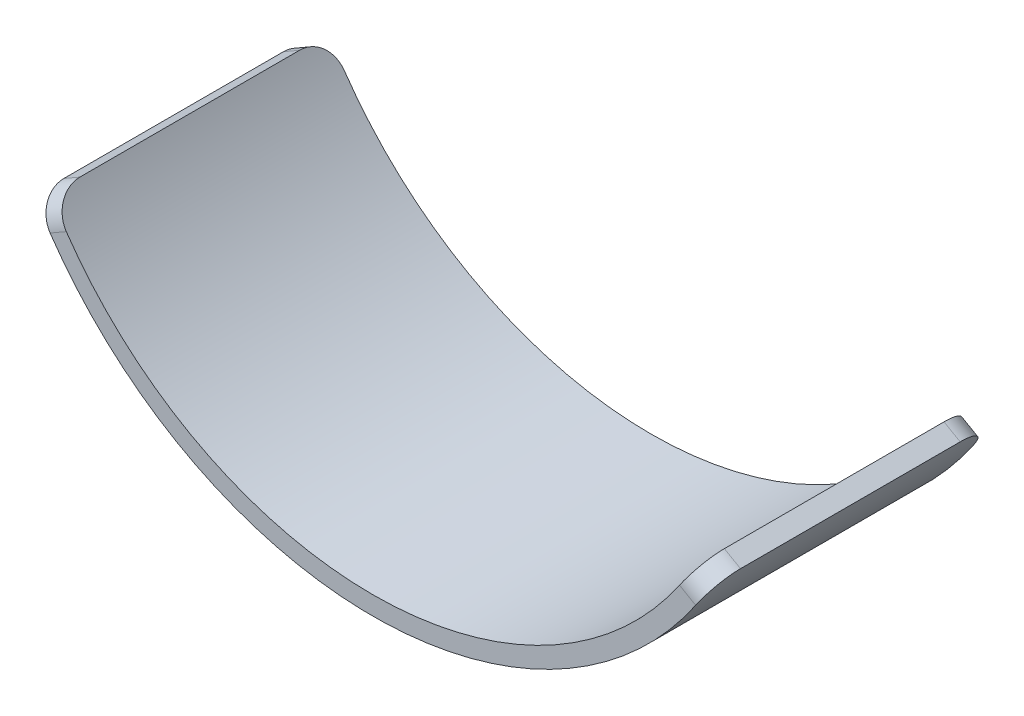
ISO-10303-21;
HEADER;
FILE_DESCRIPTION(('STEP AP214'),'2;1');
FILE_NAME('part.step','',(''),(''),'','','');
FILE_SCHEMA(('AUTOMOTIVE_DESIGN { 1 0 10303 214 1 1 1 1 }'));
ENDSEC;
DATA;
#1=APPLICATION_CONTEXT('core data for automotive mechanical design processes');
#2=APPLICATION_PROTOCOL_DEFINITION('international standard','automotive_design',2000,#1);
#3=PRODUCT_CONTEXT('',#1,'mechanical');
#4=PRODUCT('Part','Part','',(#3));
#5=PRODUCT_RELATED_PRODUCT_CATEGORY('part','',(#4));
#6=PRODUCT_DEFINITION_FORMATION('','',#4);
#7=PRODUCT_DEFINITION_CONTEXT('part definition',#1,'design');
#8=PRODUCT_DEFINITION('design','',#6,#7);
#9=PRODUCT_DEFINITION_SHAPE('','',#8);
#10=(LENGTH_UNIT() NAMED_UNIT(*) SI_UNIT(.MILLI.,.METRE.));
#11=(NAMED_UNIT(*) PLANE_ANGLE_UNIT() SI_UNIT($,.RADIAN.));
#12=(NAMED_UNIT(*) SI_UNIT($,.STERADIAN.) SOLID_ANGLE_UNIT());
#13=UNCERTAINTY_MEASURE_WITH_UNIT(LENGTH_MEASURE(1.E-05),#10,'distance_accuracy_value','');
#14=(GEOMETRIC_REPRESENTATION_CONTEXT(3) GLOBAL_UNCERTAINTY_ASSIGNED_CONTEXT((#13)) GLOBAL_UNIT_ASSIGNED_CONTEXT((#10,
#11,#12)) REPRESENTATION_CONTEXT('',''));
#15=CARTESIAN_POINT('',(0.,0.,0.));
#16=DIRECTION('',(0.,0.,1.));
#17=DIRECTION('',(1.,0.,0.));
#18=AXIS2_PLACEMENT_3D('',#15,#16,#17);
#19=CARTESIAN_POINT('',(0.,0.,95.));
#20=DIRECTION('',(0.,0.,-1.));
#21=DIRECTION('',(-1.,0.,0.));
#22=AXIS2_PLACEMENT_3D('',#19,#20,#21);
#23=CYLINDRICAL_SURFACE('',#22,254.);
#24=CARTESIAN_POINT('',(0.,0.,95.));
#25=DIRECTION('',(0.,0.,-1.));
#26=DIRECTION('',(1.,0.,0.));
#27=AXIS2_PLACEMENT_3D('',#24,#25,#26);
#28=CIRCLE('',#27,254.);
#29=CARTESIAN_POINT('',(209.483500195976,-143.640743334343,95.));
#30=VERTEX_POINT('',#29);
#31=CARTESIAN_POINT('',(-209.287482542894,-143.926195151743,95.));
#32=VERTEX_POINT('',#31);
#33=EDGE_CURVE('E124',#30,#32,#28,.T.);
#34=ORIENTED_EDGE('',*,*,#33,.F.);
#35=CARTESIAN_POINT('',(209.483500195976,-143.640743334343,95.));
#36=CARTESIAN_POINT('',(209.642523070741,-143.408827977991,95.0000003434611));
#37=CARTESIAN_POINT('',(209.801142135275,-143.176673128012,94.9941055813806));
#38=CARTESIAN_POINT('',(210.117328680405,-142.71225262432,94.9705335466837));
#39=CARTESIAN_POINT('',(210.274896182605,-142.479986972989,94.9528565168864));
#40=CARTESIAN_POINT('',(210.745590302867,-141.783672547081,94.8821744629856));
#41=CARTESIAN_POINT('',(211.056784691858,-141.319995222555,94.8115184659579));
#42=CARTESIAN_POINT('',(211.671539558162,-140.397529750414,94.6236126413965));
#43=CARTESIAN_POINT('',(211.975105305453,-139.93873836124,94.5063959750775));
#44=CARTESIAN_POINT('',(212.423315278094,-139.256631076428,94.2962729803795));
#45=CARTESIAN_POINT('',(212.571534271719,-139.030266876126,94.220512152687));
#46=CARTESIAN_POINT('',(212.865423547075,-138.579882293338,94.0576598393946));
#47=CARTESIAN_POINT('',(213.011093163694,-138.355862528448,93.9705654455164));
#48=CARTESIAN_POINT('',(213.443986130006,-137.687857812736,93.6924417248198));
#49=CARTESIAN_POINT('',(213.727021562213,-137.248037125522,93.4846056493369));
#50=CARTESIAN_POINT('',(214.280031981138,-136.383032230927,93.0256147024889));
#51=CARTESIAN_POINT('',(214.550006976631,-135.957848013714,92.7744598602262));
#52=CARTESIAN_POINT('',(214.943903545804,-135.333584092771,92.3666568133605));
#53=CARTESIAN_POINT('',(215.073367205845,-135.127733528347,92.2255324660195));
#54=CARTESIAN_POINT('',(215.328409738295,-134.72094703788,91.9331976742636));
#55=CARTESIAN_POINT('',(215.453989598811,-134.520009864553,91.7819898266869));
#56=CARTESIAN_POINT('',(215.824699794616,-133.925043177817,91.3135471225019));
#57=CARTESIAN_POINT('',(216.063827502553,-133.538816048799,90.9814653751777));
#58=CARTESIAN_POINT('',(216.524211264806,-132.791033415036,90.2808205426262));
#59=CARTESIAN_POINT('',(216.745495884409,-132.429438626058,89.9123179577717));
#60=CARTESIAN_POINT('',(217.169493958156,-131.732976546748,89.1409415416242));
#61=CARTESIAN_POINT('',(217.372207332495,-131.39810937127,88.7380675626452));
#62=CARTESIAN_POINT('',(217.758053099393,-130.757677245586,87.9007328796876));
#63=CARTESIAN_POINT('',(217.941181332571,-130.452118521153,87.4662654988677));
#64=CARTESIAN_POINT('',(218.286904135869,-129.872788947464,86.5689064046511));
#65=CARTESIAN_POINT('',(218.44949899705,-129.599017647625,86.1060150943022));
#66=CARTESIAN_POINT('',(218.753515276615,-129.085199710462,85.1546726847589));
#67=CARTESIAN_POINT('',(218.894918033943,-128.845182807458,84.6661995638383));
#68=CARTESIAN_POINT('',(219.155734284096,-128.401053323895,83.6675016613611));
#69=CARTESIAN_POINT('',(219.27514644585,-128.196942916759,83.1572755654165));
#70=CARTESIAN_POINT('',(219.491380267606,-127.826366638837,82.118993072371));
#71=CARTESIAN_POINT('',(219.58821286477,-127.659882543707,81.5909454502058));
#72=CARTESIAN_POINT('',(219.758923284947,-127.36579058947,80.5205923508483));
#73=CARTESIAN_POINT('',(219.832806508347,-127.238173584399,79.9782902606086));
#74=CARTESIAN_POINT('',(219.936378154997,-127.059026715713,79.067477947361));
#75=CARTESIAN_POINT('',(219.972573507272,-126.99634151011,78.7018463078073));
#76=CARTESIAN_POINT('',(220.034662409145,-126.888735525143,77.9671163183888));
#77=CARTESIAN_POINT('',(220.060556737735,-126.843813402486,77.5980182328281));
#78=CARTESIAN_POINT('',(220.101963809159,-126.771950116937,76.858049651307));
#79=CARTESIAN_POINT('',(220.117491693162,-126.744982729618,76.4871825406958));
#80=CARTESIAN_POINT('',(220.138204998562,-126.70900033306,75.7442117682008));
#81=CARTESIAN_POINT('',(220.143388228905,-126.699989127041,75.3721078610705));
#82=CARTESIAN_POINT('',(220.143385092535,-126.7,75.));
#83=B_SPLINE_CURVE_WITH_KNOTS('',3,(#35,#36,#37,#38,#39,#40,#41,#42,#43,#44,#45,#46,#47,#48,#49,
#50,#51,#52,#53,#54,#55,#56,#57,#58,#59,#60,#61,#62,#63,#64,#65,#66,#67,#68,#69,#70,#71,#72,#73,
#74,#75,#76,#77,#78,#79,#80,#81,#82),.UNSPECIFIED.,.F.,.F.,(4,2,2,2,2,2,2,2,2,2,2,2,2,2,2,2,2,2,
2,2,2,2,2,4),(0.,0.843473741369764,1.68693010024037,3.37344009029097,5.05875106986667,
5.90146999648618,6.74440559913225,8.43068199451458,10.1169572570319,10.9602190684224,
11.8032645441922,13.4891840570274,15.1723486327407,16.8555204409954,18.5390490046554,
20.2225537016025,21.9075322346393,23.5926127244591,25.2768752861839,26.9607412108092,
28.0783964453856,29.1959671436295,30.311901932253,31.4280730569312),.UNSPECIFIED.);
#84=CARTESIAN_POINT('',(220.143385092535,-126.7,75.));
#85=VERTEX_POINT('',#84);
#86=EDGE_CURVE('E106',#30,#85,#83,.T.);
#87=ORIENTED_EDGE('',*,*,#86,.T.);
#88=DIRECTION('',(0.,0.,-1.));
#89=VECTOR('',#88,1.);
#90=CARTESIAN_POINT('',(220.143385092535,-126.7,95.));
#91=LINE('',#90,#89);
#92=CARTESIAN_POINT('',(220.143385092535,-126.7,-75.));
#93=VERTEX_POINT('',#92);
#94=EDGE_CURVE('E135',#85,#93,#91,.T.);
#95=ORIENTED_EDGE('',*,*,#94,.T.);
#96=CARTESIAN_POINT('',(220.143385092535,-126.7,-75.));
#97=CARTESIAN_POINT('',(220.143384684367,-126.699999370622,-75.2812650762269));
#98=CARTESIAN_POINT('',(220.140425190062,-126.705143042651,-75.5624988635323));
#99=CARTESIAN_POINT('',(220.128591605819,-126.725701271113,-76.1244594242909));
#100=CARTESIAN_POINT('',(220.119717656959,-126.741115582558,-76.4051862096777));
#101=CARTESIAN_POINT('',(220.084235390617,-126.802727660124,-77.2458148428047));
#102=CARTESIAN_POINT('',(220.048766648751,-126.864294588693,-77.8043106736791));
#103=CARTESIAN_POINT('',(219.954375750966,-127.027876772323,-78.9129115231476));
#104=CARTESIAN_POINT('',(219.895471080513,-127.129861871308,-79.463022480662));
#105=CARTESIAN_POINT('',(219.789744960939,-127.312500817735,-80.2791307846382));
#106=CARTESIAN_POINT('',(219.751606155958,-127.378327311172,-80.5496680637396));
#107=CARTESIAN_POINT('',(219.66956581253,-127.519757471442,-81.0873669816297));
#108=CARTESIAN_POINT('',(219.625662798704,-127.595363641362,-81.3545277369217));
#109=CARTESIAN_POINT('',(219.485357550334,-127.836663742479,-82.1502865780609));
#110=CARTESIAN_POINT('',(219.380369050003,-128.016822054628,-82.6730844107167));
#111=CARTESIAN_POINT('',(219.147988257822,-128.414220990033,-83.699245536238));
#112=CARTESIAN_POINT('',(219.020595971714,-128.631461603784,-84.2026088340846));
#113=CARTESIAN_POINT('',(218.813184296086,-128.983754407575,-84.9402847092305));
#114=CARTESIAN_POINT('',(218.741319378129,-129.105602726198,-85.1833027628018));
#115=CARTESIAN_POINT('',(218.592242915556,-129.357847865009,-85.663097056992));
#116=CARTESIAN_POINT('',(218.515032744974,-129.488242487855,-85.8998748802563));
#117=CARTESIAN_POINT('',(218.275472660184,-129.891939648582,-86.6003417767705));
#118=CARTESIAN_POINT('',(218.105179313598,-130.177779060428,-87.0542136185956));
#119=CARTESIAN_POINT('',(217.744374720076,-130.780390477678,-87.9321286536325));
#120=CARTESIAN_POINT('',(217.553868908272,-131.097154165724,-88.356179814884));
#121=CARTESIAN_POINT('',(217.153531085938,-131.759225612809,-89.1716512098831));
#122=CARTESIAN_POINT('',(216.943698977119,-132.104533517017,-89.5630712776578));
#123=CARTESIAN_POINT('',(216.505770039948,-132.821036802148,-90.3105372361509));
#124=CARTESIAN_POINT('',(216.277669997638,-133.19223673688,-90.6665768774363));
#125=CARTESIAN_POINT('',(215.804473836618,-133.957573256686,-91.3406724401623));
#126=CARTESIAN_POINT('',(215.559377991176,-134.351709472961,-91.6587289720946));
#127=CARTESIAN_POINT('',(215.053800696672,-135.159496862895,-92.2543325413411));
#128=CARTESIAN_POINT('',(214.793333658233,-135.573129687314,-92.531916700243));
#129=CARTESIAN_POINT('',(214.258309310787,-136.417104816758,-93.044986513364));
#130=CARTESIAN_POINT('',(213.983751168383,-136.847448109731,-93.280469673882));
#131=CARTESIAN_POINT('',(213.422357973758,-137.721337202835,-93.7075714700058));
#132=CARTESIAN_POINT('',(213.135528598348,-138.164876869863,-93.8992101335996));
#133=CARTESIAN_POINT('',(212.551302248038,-139.061965344334,-94.2374120889934));
#134=CARTESIAN_POINT('',(212.253907778357,-139.515511769414,-94.3839859881087));
#135=CARTESIAN_POINT('',(211.752347267488,-140.274998440097,-94.5894007924641));
#136=CARTESIAN_POINT('',(211.550586677344,-140.579101435355,-94.6611564252558));
#137=CARTESIAN_POINT('',(211.143848031122,-141.189269512303,-94.7842832512148));
#138=CARTESIAN_POINT('',(210.938870217263,-141.495334445265,-94.8356559713907));
#139=CARTESIAN_POINT('',(210.52661522237,-142.10798814486,-94.9178099674668));
#140=CARTESIAN_POINT('',(210.319341990467,-142.414575417822,-94.9486222873447));
#141=CARTESIAN_POINT('',(209.902772411781,-143.027843587314,-94.98972486646));
#142=CARTESIAN_POINT('',(209.693475657986,-143.334524490135,-95.0000109069705));
#143=CARTESIAN_POINT('',(209.483500195976,-143.640743334343,-95.));
#144=B_SPLINE_CURVE_WITH_KNOTS('',3,(#96,#97,#98,#99,#100,#101,#102,#103,#104,#105,#106,#107,
#108,#109,#110,#111,#112,#113,#114,#115,#116,#117,#118,#119,#120,#121,#122,#123,#124,#125,#126,
#127,#128,#129,#130,#131,#132,#133,#134,#135,#136,#137,#138,#139,#140,#141,#142,#143),
.UNSPECIFIED.,.F.,.F.,(4,2,2,2,2,2,2,2,2,2,2,2,2,2,2,2,2,2,2,2,2,2,2,4),(0.,0.843670174301789,
1.68732022501942,3.37418462844939,5.05979282129789,5.9026657838051,6.74575490625337,
8.43217045105545,10.1185855636327,10.9619438633903,11.8050861713744,13.4912020821224,
15.176865739906,16.8625379710306,18.5485074241275,20.2344497754711,21.9188359054978,
23.6033217710425,25.2870366271022,26.9703548674986,28.0856321721689,29.2008259088181,
30.3143319904483,31.4280669052796),.UNSPECIFIED.);
#145=CARTESIAN_POINT('',(209.483500195976,-143.640743334343,-95.));
#146=VERTEX_POINT('',#145);
#147=EDGE_CURVE('E117',#93,#146,#144,.T.);
#148=ORIENTED_EDGE('',*,*,#147,.T.);
#149=CARTESIAN_POINT('',(0.,0.,-95.));
#150=DIRECTION('',(0.,0.,-1.));
#151=DIRECTION('',(1.,0.,0.));
#152=AXIS2_PLACEMENT_3D('',#149,#150,#151);
#153=CIRCLE('',#152,254.);
#154=CARTESIAN_POINT('',(-209.287482542894,-143.926195151743,-95.));
#155=VERTEX_POINT('',#154);
#156=EDGE_CURVE('E138',#146,#155,#153,.T.);
#157=ORIENTED_EDGE('',*,*,#156,.T.);
#158=CARTESIAN_POINT('',(-209.287482542894,-143.926195151743,-95.));
#159=CARTESIAN_POINT('',(-209.446821436151,-143.694496804089,-95.0000003434611));
#160=CARTESIAN_POINT('',(-209.60575684605,-143.462558412522,-94.9941055813806));
#161=CARTESIAN_POINT('',(-209.922576233943,-142.99856939215,-94.9705335466837));
#162=CARTESIAN_POINT('',(-210.080460233538,-142.766518765757,-94.9528565168864));
#163=CARTESIAN_POINT('',(-210.552103190031,-142.070846676214,-94.8821744629856));
#164=CARTESIAN_POINT('',(-210.863929413261,-141.607594028596,-94.8115184659579));
#165=CARTESIAN_POINT('',(-211.479941289805,-140.685967498545,-94.6236126413965));
#166=CARTESIAN_POINT('',(-211.784132217511,-140.227590381741,-94.5063959750775));
#167=CARTESIAN_POINT('',(-212.233271678922,-139.546094767836,-94.2962729803795));
#168=CARTESIAN_POINT('',(-212.381799133282,-139.319932842325,-94.220512152687));
#169=CARTESIAN_POINT('',(-212.676302137188,-138.869949332325,-94.0576598393946));
#170=CARTESIAN_POINT('',(-212.822277020782,-138.646128364524,-93.9705654455164));
#171=CARTESIAN_POINT('',(-213.256080264305,-137.978714425199,-93.6924417248197));
#172=CARTESIAN_POINT('',(-213.539715033569,-137.539280004096,-93.4846056493369));
#173=CARTESIAN_POINT('',(-214.093904185083,-136.675029823039,-93.025614702489));
#174=CARTESIAN_POINT('',(-214.364458576119,-136.250214053263,-92.7744598602262));
#175=CARTESIAN_POINT('',(-214.759205827658,-135.626487704935,-92.3666568133605));
#176=CARTESIAN_POINT('',(-214.888949999971,-135.420813827411,-92.2255324660196));
#177=CARTESIAN_POINT('',(-215.144546860532,-135.014375410112,-91.9331976742637));
#178=CARTESIAN_POINT('',(-215.270400538587,-134.813609624402,-91.7819898266869));
#179=CARTESIAN_POINT('',(-215.641921497882,-134.219148873465,-91.3135471225019));
#180=CARTESIAN_POINT('',(-215.881575520492,-133.833248102101,-90.9814653751777));
#181=CARTESIAN_POINT('',(-216.34297829429,-133.086093796595,-90.2808205426263));
#182=CARTESIAN_POINT('',(-216.564755664295,-132.724801017201,-89.9123179577718));
#183=CARTESIAN_POINT('',(-216.989702818959,-132.028917614466,-89.1409415416243));
#184=CARTESIAN_POINT('',(-217.192872523656,-131.694327105872,-88.7380675626452));
#185=CARTESIAN_POINT('',(-217.57959102224,-131.054421592304,-87.9007328796876));
#186=CARTESIAN_POINT('',(-217.763135648263,-130.749112807429,-87.4662654988677));
#187=CARTESIAN_POINT('',(-218.109647920461,-130.170255090121,-86.5689064046511));
#188=CARTESIAN_POINT('',(-218.272615858311,-129.896705707503,-86.1060150943022));
#189=CARTESIAN_POINT('',(-218.577332334631,-129.383302708047,-85.1546726847589));
#190=CARTESIAN_POINT('',(-218.719062171526,-129.143478800061,-84.6661995638382));
#191=CARTESIAN_POINT('',(-218.980483653493,-128.69970529558,-83.6675016613611));
#192=CARTESIAN_POINT('',(-219.100173964533,-128.49575787069,-83.1572755654165));
#193=CARTESIAN_POINT('',(-219.316912785696,-128.125476725031,-82.118993072371));
#194=CARTESIAN_POINT('',(-219.413972257817,-127.959124794845,-81.5909454502058));
#195=CARTESIAN_POINT('',(-219.585083449924,-127.665265840516,-80.5205923508483));
#196=CARTESIAN_POINT('',(-219.659140582763,-127.53774967778,-79.9782902606086));
#197=CARTESIAN_POINT('',(-219.762956361051,-127.358744173037,-79.067477947361));
#198=CARTESIAN_POINT('',(-219.799237137367,-127.296108370195,-78.7018463078073));
#199=CARTESIAN_POINT('',(-219.861472678954,-127.188587129968,-77.9671163183888));
#200=CARTESIAN_POINT('',(-219.887428225048,-127.143700350354,-77.5980182328281));
#201=CARTESIAN_POINT('',(-219.92893322799,-127.071893581143,-76.858049651307));
#202=CARTESIAN_POINT('',(-219.944497861745,-127.044947387784,-76.4871825406958));
#203=CARTESIAN_POINT('',(-219.965260202088,-127.008993262762,-75.7442117682008));
#204=CARTESIAN_POINT('',(-219.970455712438,-126.999989131327,-75.3721078610705));
#205=CARTESIAN_POINT('',(-219.970452561248,-127.,-75.));
#206=B_SPLINE_CURVE_WITH_KNOTS('',3,(#158,#159,#160,#161,#162,#163,#164,#165,#166,#167,#168,
#169,#170,#171,#172,#173,#174,#175,#176,#177,#178,#179,#180,#181,#182,#183,#184,#185,#186,#187,
#188,#189,#190,#191,#192,#193,#194,#195,#196,#197,#198,#199,#200,#201,#202,#203,#204,#205),
.UNSPECIFIED.,.F.,.F.,(4,2,2,2,2,2,2,2,2,2,2,2,2,2,2,2,2,2,2,2,2,2,2,4),(0.,0.843473741369786,
1.68693010024039,3.37344009029097,5.05875106986665,5.90146999648614,6.74440559913221,
8.43068199451452,10.1169572570319,10.9602190684223,11.8032645441921,13.4891840570273,
15.1723486327407,16.8555204409954,18.5390490046554,20.2225537016025,21.9075322346393,
23.5926127244591,25.2768752861839,26.9607412108092,28.0783964453856,29.1959671436295,
30.311901932253,31.4280730569312),.UNSPECIFIED.);
#207=CARTESIAN_POINT('',(-219.970452561248,-127.,-75.));
#208=VERTEX_POINT('',#207);
#209=EDGE_CURVE('E127',#155,#208,#206,.T.);
#210=ORIENTED_EDGE('',*,*,#209,.T.);
#211=DIRECTION('',(0.,0.,-1.));
#212=VECTOR('',#211,1.);
#213=CARTESIAN_POINT('',(-219.970452561248,-127.,95.));
#214=LINE('',#213,#212);
#215=CARTESIAN_POINT('',(-219.970452561248,-127.,75.));
#216=VERTEX_POINT('',#215);
#217=EDGE_CURVE('E149',#216,#208,#214,.T.);
#218=ORIENTED_EDGE('',*,*,#217,.F.);
#219=CARTESIAN_POINT('',(-219.970452561248,-127.,75.));
#220=CARTESIAN_POINT('',(-219.970452153938,-126.999999370065,75.2812650762269));
#221=CARTESIAN_POINT('',(-219.967485650103,-127.005139002686,75.5624988635323));
#222=CARTESIAN_POINT('',(-219.955624050172,-127.02568107952,76.1244594242909));
#223=CARTESIAN_POINT('',(-219.94672909549,-127.041083278937,76.4051862096777));
#224=CARTESIAN_POINT('',(-219.911162867421,-127.102646926877,77.2458148428047));
#225=CARTESIAN_POINT('',(-219.875610225367,-127.164165444301,77.8043106736791));
#226=CARTESIAN_POINT('',(-219.780996406484,-127.32761879441,78.9129115231476));
#227=CARTESIAN_POINT('',(-219.721952756215,-127.429523494887,79.463022480662));
#228=CARTESIAN_POINT('',(-219.615977746316,-127.61201813697,80.2791307846382));
#229=CARTESIAN_POINT('',(-219.577749236635,-127.677792575251,80.5496680637396));
#230=CARTESIAN_POINT('',(-219.49551616011,-127.819110759887,81.0873669816297));
#231=CARTESIAN_POINT('',(-219.451510114473,-127.894657007315,81.3545277369217));
#232=CARTESIAN_POINT('',(-219.310876036155,-128.135765608436,82.1502865780609));
#233=CARTESIAN_POINT('',(-219.205642026619,-128.315780624129,82.6730844107167));
#234=CARTESIAN_POINT('',(-218.972719683162,-128.712862389455,83.699245536238));
#235=CARTESIAN_POINT('',(-218.845031354997,-128.929929129591,84.2026088340846));
#236=CARTESIAN_POINT('',(-218.637139597313,-129.281938845191,84.9402847092305));
#237=CARTESIAN_POINT('',(-218.565108632394,-129.403689078362,85.1833027628018));
#238=CARTESIAN_POINT('',(-218.415688426839,-129.655730749358,85.663097056992));
#239=CARTESIAN_POINT('',(-218.338300563231,-129.786019991718,85.8998748802563));
#240=CARTESIAN_POINT('',(-218.098190347573,-130.189390189106,86.6003417767705));
#241=CARTESIAN_POINT('',(-217.927507479219,-130.474997177302,87.0542136185956));
#242=CARTESIAN_POINT('',(-217.565881691071,-131.077116155787,87.9321286536325));
#243=CARTESIAN_POINT('',(-217.374944217742,-131.393619836135,88.356179814884));
#244=CARTESIAN_POINT('',(-216.973704176669,-132.055144894222,89.1716512098831));
#245=CARTESIAN_POINT('',(-216.763401510438,-132.400166416995,89.5630712776578));
#246=CARTESIAN_POINT('',(-216.32449618346,-133.116072015217,90.3105372361509));
#247=CARTESIAN_POINT('',(-216.09589030255,-133.486960640089,90.6665768774363));
#248=CARTESIAN_POINT('',(-215.621651210976,-134.2516513484,91.3406724401623));
#249=CARTESIAN_POINT('',(-215.376018274083,-134.645453063411,91.6587289720946));
#250=CARTESIAN_POINT('',(-214.869340206566,-135.452550457752,92.2543325413411));
#251=CARTESIAN_POINT('',(-214.608309511566,-135.865827807503,92.531916700243));
#252=CARTESIAN_POINT('',(-214.07213508434,-136.709072763059,93.044986513364));
#253=CARTESIAN_POINT('',(-213.796990517371,-137.139041355673,93.280469673882));
#254=CARTESIAN_POINT('',(-213.234406486272,-138.012164298888,93.7075714700058));
#255=CARTESIAN_POINT('',(-212.946972707307,-138.455312524131,93.8992101335996));
#256=CARTESIAN_POINT('',(-212.361523914418,-139.351603699101,94.2374120889934));
#257=CARTESIAN_POINT('',(-212.063511408958,-139.804744269884,94.3839859881087));
#258=CARTESIAN_POINT('',(-211.560915968894,-140.563546465871,94.5894007924641));
#259=CARTESIAN_POINT('',(-211.35874098779,-140.867374121749,94.6611564252558));
#260=CARTESIAN_POINT('',(-210.95117088776,-141.476987131795,94.7842832512148));
#261=CARTESIAN_POINT('',(-210.745776011256,-141.782772337567,94.8356559713907));
#262=CARTESIAN_POINT('',(-210.332686179074,-142.394863447608,94.9178099674668));
#263=CARTESIAN_POINT('',(-210.124995174561,-142.70116786359,94.9486222873448));
#264=CARTESIAN_POINT('',(-209.707589924899,-143.313867560956,94.98972486646));
#265=CARTESIAN_POINT('',(-209.497875272731,-143.620262848078,95.0000109069706));
#266=CARTESIAN_POINT('',(-209.287482542894,-143.926195151743,95.));
#267=B_SPLINE_CURVE_WITH_KNOTS('',3,(#219,#220,#221,#222,#223,#224,#225,#226,#227,#228,#229,
#230,#231,#232,#233,#234,#235,#236,#237,#238,#239,#240,#241,#242,#243,#244,#245,#246,#247,#248,
#249,#250,#251,#252,#253,#254,#255,#256,#257,#258,#259,#260,#261,#262,#263,#264,#265,#266),
.UNSPECIFIED.,.F.,.F.,(4,2,2,2,2,2,2,2,2,2,2,2,2,2,2,2,2,2,2,2,2,2,2,4),(0.,0.843670174301775,
1.6873202250194,3.37418462844939,5.05979282129787,5.90266578380509,6.74575490625337,
8.43217045105543,10.1185855636327,10.9619438633902,11.8050861713743,13.4912020821224,
15.176865739906,16.8625379710307,18.5485074241275,20.2344497754711,21.9188359054977,
23.6033217710425,25.2870366271022,26.9703548674986,28.0856321721689,29.2008259088181,
30.3143319904483,31.4280669052795),.UNSPECIFIED.);
#268=EDGE_CURVE('E132',#216,#32,#267,.T.);
#269=ORIENTED_EDGE('',*,*,#268,.T.);
#270=EDGE_LOOP('',(#34,#87,#95,#148,#157,#210,#218,#269));
#271=FACE_BOUND('',#270,.T.);
#272=ADVANCED_FACE('F39',(#271),#23,.F.);
#273=CARTESIAN_POINT('',(-219.970452561248,-127.,95.));
#274=DIRECTION('',(0.499999999999997,-0.86602540378444,0.));
#275=DIRECTION('',(0.86602540378444,0.499999999999997,0.));
#276=AXIS2_PLACEMENT_3D('',#273,#274,#275);
#277=PLANE('',#276);
#278=DIRECTION('',(0.,0.,-1.));
#279=VECTOR('',#278,1.);
#280=CARTESIAN_POINT('',(-230.96897518931,-133.349999999999,95.));
#281=LINE('',#280,#279);
#282=CARTESIAN_POINT('',(-230.96897518931,-133.349999999999,75.));
#283=VERTEX_POINT('',#282);
#284=CARTESIAN_POINT('',(-230.96897518931,-133.349999999999,-75.));
#285=VERTEX_POINT('',#284);
#286=EDGE_CURVE('E147',#283,#285,#281,.T.);
#287=ORIENTED_EDGE('',*,*,#286,.F.);
#288=DIRECTION('',(-0.86602540378444,-0.499999999999997,0.));
#289=VECTOR('',#288,1.);
#290=CARTESIAN_POINT('',(-219.970452561248,-127.,75.));
#291=LINE('',#290,#289);
#292=EDGE_CURVE('E11',#283,#216,#291,.F.);
#293=ORIENTED_EDGE('',*,*,#292,.T.);
#294=ORIENTED_EDGE('',*,*,#217,.T.);
#295=DIRECTION('',(-0.86602540378444,-0.499999999999997,0.));
#296=VECTOR('',#295,1.);
#297=CARTESIAN_POINT('',(-219.970452561248,-127.,-75.));
#298=LINE('',#297,#296);
#299=EDGE_CURVE('E48',#208,#285,#298,.T.);
#300=ORIENTED_EDGE('',*,*,#299,.T.);
#301=EDGE_LOOP('',(#287,#293,#294,#300));
#302=FACE_BOUND('',#301,.T.);
#303=ADVANCED_FACE('F168',(#302),#277,.F.);
#304=CARTESIAN_POINT('',(0.,0.,95.));
#305=DIRECTION('',(0.,0.,-1.));
#306=DIRECTION('',(-1.,0.,0.));
#307=AXIS2_PLACEMENT_3D('',#304,#305,#306);
#308=CYLINDRICAL_SURFACE('',#307,266.7);
#309=DIRECTION('',(0.,0.,-1.));
#310=VECTOR('',#309,1.);
#311=CARTESIAN_POINT('',(231.150554347161,-133.035,95.));
#312=LINE('',#311,#310);
#313=CARTESIAN_POINT('',(231.150554347161,-133.035,75.));
#314=VERTEX_POINT('',#313);
#315=CARTESIAN_POINT('',(231.150554347161,-133.035,-75.));
#316=VERTEX_POINT('',#315);
#317=EDGE_CURVE('E144',#314,#316,#312,.T.);
#318=ORIENTED_EDGE('',*,*,#317,.F.);
#319=CARTESIAN_POINT('',(231.150554347161,-133.035,75.));
#320=CARTESIAN_POINT('',(231.150553966537,-133.034999386479,75.2812666794508));
#321=CARTESIAN_POINT('',(231.1475944076,-133.040143099372,75.5625020693995));
#322=CARTESIAN_POINT('',(231.135760746639,-133.060701595526,76.1244658271608));
#323=CARTESIAN_POINT('',(231.126886785686,-133.076116133806,76.4051942069066));
#324=CARTESIAN_POINT('',(231.091404917768,-133.137729373408,77.2458275830406));
#325=CARTESIAN_POINT('',(231.055937020896,-133.199297718579,77.8043265387715));
#326=CARTESIAN_POINT('',(230.961553821094,-133.362886688941,78.9129329501428));
#327=CARTESIAN_POINT('',(230.902656022462,-133.4648771149,79.463046352711));
#328=CARTESIAN_POINT('',(230.796950710364,-133.647530457365,80.2791582075632));
#329=CARTESIAN_POINT('',(230.75882059154,-133.713362817786,80.5496966519982));
#330=CARTESIAN_POINT('',(230.676802418603,-133.854807593507,81.0873978568474));
#331=CARTESIAN_POINT('',(230.632912890432,-133.93042251248,81.3545597338088));
#332=CARTESIAN_POINT('',(230.492657405411,-134.171754324754,82.1503216946806));
#333=CARTESIAN_POINT('',(230.387714463064,-134.35194110522,82.6731214722908));
#334=CARTESIAN_POINT('',(230.155462524674,-134.749419222285,83.699286435604));
#335=CARTESIAN_POINT('',(230.028153533548,-134.966710550724,84.2026516255815));
#336=CARTESIAN_POINT('',(229.820906293609,-135.319102692317,84.9403303975628));
#337=CARTESIAN_POINT('',(229.74910278512,-135.440987991796,85.1833494028172));
#338=CARTESIAN_POINT('',(229.600164296917,-135.693316055468,85.6631456764602));
#339=CARTESIAN_POINT('',(229.523030687369,-135.82375661999,85.8999245274969));
#340=CARTESIAN_POINT('',(229.28372611108,-136.227606937433,86.600394697842));
#341=CARTESIAN_POINT('',(229.113637553727,-136.513568891531,87.0542689542403));
#342=CARTESIAN_POINT('',(228.753323658674,-137.116483972093,87.9322003042184));
#343=CARTESIAN_POINT('',(228.56310324855,-137.433429513412,88.3562646521282));
#344=CARTESIAN_POINT('',(228.163437401864,-138.095928387899,89.1717622030775));
#345=CARTESIAN_POINT('',(227.953991867077,-138.441481867232,89.5631952393762));
#346=CARTESIAN_POINT('',(227.516952577052,-139.158551935516,90.3106879666523));
#347=CARTESIAN_POINT('',(227.289355587002,-139.530073150771,90.6667413270297));
#348=CARTESIAN_POINT('',(226.817296586941,-140.296138007832,91.3408640304342));
#349=CARTESIAN_POINT('',(226.572834847012,-140.69068128093,91.6589339815302));
#350=CARTESIAN_POINT('',(226.068642448843,-141.499419593709,92.2545937251224));
#351=CARTESIAN_POINT('',(225.808924496311,-141.913598226682,92.532216550566));
#352=CARTESIAN_POINT('',(225.275547588063,-142.758773183605,93.0453524941903));
#353=CARTESIAN_POINT('',(225.001887805017,-143.189770505247,93.280863109621));
#354=CARTESIAN_POINT('',(224.442447748568,-144.065080174143,93.708004741804));
#355=CARTESIAN_POINT('',(224.156673126707,-144.509386285104,93.8996559576079));
#356=CARTESIAN_POINT('',(223.574715258774,-145.408125870516,94.2378650213667));
#357=CARTESIAN_POINT('',(223.278534485348,-145.862556929876,94.3844335019425));
#358=CARTESIAN_POINT('',(222.779281721112,-146.623372027658,94.5897551164874));
#359=CARTESIAN_POINT('',(222.578573670448,-146.927883157946,94.6614454960399));
#360=CARTESIAN_POINT('',(222.174013388039,-147.538916846383,94.7844626277949));
#361=CARTESIAN_POINT('',(221.970161393576,-147.845439251743,94.8357909090415));
#362=CARTESIAN_POINT('',(221.560226208798,-148.459058308296,94.917875478062));
#363=CARTESIAN_POINT('',(221.354146855765,-148.766153391696,94.9486627367114));
#364=CARTESIAN_POINT('',(220.940031575266,-149.380487921298,94.9897325509897));
#365=CARTESIAN_POINT('',(220.731995252899,-149.687727384212,95.0000108748591));
#366=CARTESIAN_POINT('',(220.523311617656,-149.994530010871,95.));
#367=B_SPLINE_CURVE_WITH_KNOTS('',3,(#319,#320,#321,#322,#323,#324,#325,#326,#327,#328,#329,
#330,#331,#332,#333,#334,#335,#336,#337,#338,#339,#340,#341,#342,#343,#344,#345,#346,#347,#348,
#349,#350,#351,#352,#353,#354,#355,#356,#357,#358,#359,#360,#361,#362,#363,#364,#365,#366),
.UNSPECIFIED.,.F.,.F.,(4,2,2,2,2,2,2,2,2,2,2,2,2,2,2,2,2,2,2,2,2,2,2,4),(0.,0.843674981745989,
1.68732984070573,3.37420381195937,5.05981989248055,5.90269680620662,6.74578986763155,
8.43221269692614,10.1186351553066,10.9619969573207,11.8051427636081,13.491265746067,
15.1769769747273,16.8626968165732,18.5487177486067,20.2347116858373,21.9193208680611,
23.6040301342093,25.2879619542446,26.9714963192149,28.0860301409831,29.2004802535984,
30.3132462256476,31.4262417791621),.UNSPECIFIED.);
#368=CARTESIAN_POINT('',(220.523311617656,-149.994530010871,95.));
#369=VERTEX_POINT('',#368);
#370=EDGE_CURVE('E199',#314,#369,#367,.T.);
#371=ORIENTED_EDGE('',*,*,#370,.T.);
#372=CARTESIAN_POINT('',(0.,0.,95.));
#373=DIRECTION('',(0.,0.,1.));
#374=DIRECTION('',(1.,0.,0.));
#375=AXIS2_PLACEMENT_3D('',#372,#373,#374);
#376=CIRCLE('',#375,266.7);
#377=CARTESIAN_POINT('',(-220.318621696119,-150.295026311326,95.));
#378=VERTEX_POINT('',#377);
#379=EDGE_CURVE('E126',#378,#369,#376,.T.);
#380=ORIENTED_EDGE('',*,*,#379,.F.);
#381=CARTESIAN_POINT('',(-220.318621696119,-150.295026311326,95.));
#382=CARTESIAN_POINT('',(-220.477092445593,-150.06272399556,95.0000003433214));
#383=CARTESIAN_POINT('',(-220.635177195504,-149.830195746458,94.994101839726));
#384=CARTESIAN_POINT('',(-220.950331195662,-149.365056185984,94.9705157141034));
#385=CARTESIAN_POINT('',(-221.107400467071,-149.132444876452,94.9528283385491));
#386=CARTESIAN_POINT('',(-221.576654479767,-148.435136797034,94.8821067403959));
#387=CARTESIAN_POINT('',(-221.886961895096,-147.970853759197,94.8114130369754));
#388=CARTESIAN_POINT('',(-222.50009090336,-147.047293657584,94.6234162834635));
#389=CARTESIAN_POINT('',(-222.802917690644,-146.588013251507,94.5061465993239));
#390=CARTESIAN_POINT('',(-223.250129812505,-145.905255938731,94.2959368901641));
#391=CARTESIAN_POINT('',(-223.398034654577,-145.678688905161,94.2201459303735));
#392=CARTESIAN_POINT('',(-223.691331743672,-145.227925755997,94.0572315826617));
#393=CARTESIAN_POINT('',(-223.83672333509,-145.003730264788,93.9701052868802));
#394=CARTESIAN_POINT('',(-224.268832613525,-144.335242080772,93.6918858668125));
#395=CARTESIAN_POINT('',(-224.551415798051,-143.89515308483,93.4839846658315));
#396=CARTESIAN_POINT('',(-225.103656381624,-143.029708269335,93.0248633516071));
#397=CARTESIAN_POINT('',(-225.373313788377,-142.604352440998,92.7736432641896));
#398=CARTESIAN_POINT('',(-225.766826766705,-141.979894985287,92.3657437143892));
#399=CARTESIAN_POINT('',(-225.896178192491,-141.773990283228,92.2245872109633));
#400=CARTESIAN_POINT('',(-226.151025301739,-141.367115551043,91.932188832087));
#401=CARTESIAN_POINT('',(-226.276521965723,-141.166144268675,91.7809495529174));
#402=CARTESIAN_POINT('',(-226.647023382506,-140.571102984614,91.3124138576442));
#403=CARTESIAN_POINT('',(-226.886066241656,-140.18486316658,90.9802719014485));
#404=CARTESIAN_POINT('',(-227.346407332199,-139.437060063614,90.2794581285542));
#405=CARTESIAN_POINT('',(-227.567731359818,-139.075461023626,89.9108412307979));
#406=CARTESIAN_POINT('',(-227.991876008767,-138.379047201026,89.1392306742146));
#407=CARTESIAN_POINT('',(-228.19469654879,-138.04423253611,88.7362368643466));
#408=CARTESIAN_POINT('',(-228.580804368212,-137.40395090725,87.8986587292765));
#409=CARTESIAN_POINT('',(-228.764087518291,-137.098490148734,87.4640677583835));
#410=CARTESIAN_POINT('',(-229.110147949996,-136.519390287354,86.5664587565277));
#411=CARTESIAN_POINT('',(-229.27292552459,-136.245750729858,86.1034411318434));
#412=CARTESIAN_POINT('',(-229.577305741533,-135.732236002809,85.151875550009));
#413=CARTESIAN_POINT('',(-229.71889110946,-135.492388387361,84.663307198664));
#414=CARTESIAN_POINT('',(-229.980065278526,-135.048605725923,83.6644218286194));
#415=CARTESIAN_POINT('',(-230.09965274639,-134.844672856728,83.154103493979));
#416=CARTESIAN_POINT('',(-230.316213218252,-134.474450801468,82.1156414542147));
#417=CARTESIAN_POINT('',(-230.413197197804,-134.308143346822,81.587506543481));
#418=CARTESIAN_POINT('',(-230.584172710063,-134.014395658043,80.5169845678029));
#419=CARTESIAN_POINT('',(-230.658169662977,-133.886946261537,79.9746008953971));
#420=CARTESIAN_POINT('',(-230.761850363309,-133.708134005883,79.0640084089775));
#421=CARTESIAN_POINT('',(-230.798064485548,-133.645603252492,78.6986804987282));
#422=CARTESIAN_POINT('',(-230.860187165781,-133.538263555069,77.9645669459644));
#423=CARTESIAN_POINT('',(-230.886096504191,-133.493453269007,77.5957815674617));
#424=CARTESIAN_POINT('',(-230.927528113772,-133.42176944591,76.8564448591676));
#425=CARTESIAN_POINT('',(-230.943065559644,-133.394869704823,76.4858969116509));
#426=CARTESIAN_POINT('',(-230.963791820005,-133.358977700436,75.743567455945));
#427=CARTESIAN_POINT('',(-230.968978439872,-133.349989234753,75.3717857028936));
#428=CARTESIAN_POINT('',(-230.96897518931,-133.349999999999,75.));
#429=B_SPLINE_CURVE_WITH_KNOTS('',3,(#381,#382,#383,#384,#385,#386,#387,#388,#389,#390,#391,
#392,#393,#394,#395,#396,#397,#398,#399,#400,#401,#402,#403,#404,#405,#406,#407,#408,#409,#410,
#411,#412,#413,#414,#415,#416,#417,#418,#419,#420,#421,#422,#423,#424,#425,#426,#427,#428),
.UNSPECIFIED.,.F.,.F.,(4,2,2,2,2,2,2,2,2,2,2,2,2,2,2,2,2,2,2,2,2,2,2,4),(0.,0.843496772434736,
1.68697591022474,3.37352835653576,5.05887476877925,5.90161192183635,6.74456569058228,
8.43086225833711,10.117157820748,10.9604320830933,11.8034900376406,13.4894348368114,
15.1728787199862,16.8563300000445,18.5401363829832,20.2239187062873,21.9090661443253,
23.594315684101,25.2787452060965,26.9627772474105,28.0794677552193,29.1960736761715,
30.3110423341461,31.4262473669688),.UNSPECIFIED.);
#430=EDGE_CURVE('E63',#378,#283,#429,.T.);
#431=ORIENTED_EDGE('',*,*,#430,.T.);
#432=ORIENTED_EDGE('',*,*,#286,.T.);
#433=CARTESIAN_POINT('',(-230.96897518931,-133.349999999999,-75.));
#434=CARTESIAN_POINT('',(-230.968974809522,-133.34999938596,-75.2812666794508));
#435=CARTESIAN_POINT('',(-230.966008241,-133.355139059356,-75.5625020693995));
#436=CARTESIAN_POINT('',(-230.954146563986,-133.375681403778,-76.1244658271608));
#437=CARTESIAN_POINT('',(-230.945251596901,-133.391083830013,-76.4051942069066));
#438=CARTESIAN_POINT('',(-230.909685765673,-133.452648640532,-77.2458275830406));
#439=CARTESIAN_POINT('',(-230.87413396668,-133.514168575707,-77.8043265387715));
#440=CARTESIAN_POINT('',(-230.77952783652,-133.677628723038,-78.9129329501428));
#441=CARTESIAN_POINT('',(-230.720491050804,-133.779538759851,-79.463046352711));
#442=CARTESIAN_POINT('',(-230.614536828736,-133.962047826325,-80.2791582075632));
#443=CARTESIAN_POINT('',(-230.576316997205,-134.027828143426,-80.5496966519982));
#444=CARTESIAN_POINT('',(-230.494106071225,-134.169160973724,-81.0873978568474));
#445=CARTESIAN_POINT('',(-230.450113499304,-134.244715988581,-81.3545597338087));
#446=CARTESIAN_POINT('',(-230.309529141057,-134.485856368672,-82.1503216946806));
#447=CARTESIAN_POINT('',(-230.204340650652,-134.665899914765,-82.6731214722908));
#448=CARTESIAN_POINT('',(-229.971547052919,-135.063061037341,-83.699286435604));
#449=CARTESIAN_POINT('',(-229.84394195052,-135.280178605672,-84.2026516255814));
#450=CARTESIAN_POINT('',(-229.636214492947,-135.632287883155,-84.9403303975628));
#451=CARTESIAN_POINT('',(-229.564244887024,-135.754075180865,-85.1833494028171));
#452=CARTESIAN_POINT('',(-229.41496254266,-136.006199964744,-85.6631456764602));
#453=CARTESIAN_POINT('',(-229.337651177384,-136.136535253112,-85.8999245274969));
#454=CARTESIAN_POINT('',(-229.097796261194,-136.540058955403,-86.600394697842));
#455=CARTESIAN_POINT('',(-228.927318014823,-136.825788764923,-87.0542689542403));
#456=CARTESIAN_POINT('',(-228.566182510708,-137.428212075399,-87.9322003042183));
#457=CARTESIAN_POINT('',(-228.375530190876,-137.744897997935,-88.3562646521282));
#458=CARTESIAN_POINT('',(-227.974961542123,-138.406851399119,-89.1717622030774));
#459=CARTESIAN_POINT('',(-227.765045114777,-138.752119023799,-89.5631952393762));
#460=CARTESIAN_POINT('',(-227.327028661432,-139.468592617487,-90.3106879666522));
#461=CARTESIAN_POINT('',(-227.098925394318,-139.839803208388,-90.6667413270297));
#462=CARTESIAN_POINT('',(-226.625822469716,-140.605223803547,-91.3408640304341));
#463=CARTESIAN_POINT('',(-226.380823082814,-140.999433439469,-91.6589339815302));
#464=CARTESIAN_POINT('',(-225.875528613968,-141.807483643777,-92.2545937251224));
#465=CARTESIAN_POINT('',(-225.615246260087,-142.221307822791,-92.532216550566));
#466=CARTESIAN_POINT('',(-225.080717634823,-143.065754850637,-93.0453524941902));
#467=CARTESIAN_POINT('',(-224.806470534752,-143.49637869603,-93.280863109621));
#468=CARTESIAN_POINT('',(-224.245837703366,-144.370924876398,-93.708004741804));
#469=CARTESIAN_POINT('',(-223.959457632091,-144.814840982788,-93.8996559576078));
#470=CARTESIAN_POINT('',(-223.376275068539,-145.71278635975,-94.2378650213667));
#471=CARTESIAN_POINT('',(-223.079475052199,-146.166813218601,-94.3844335019425));
#472=CARTESIAN_POINT('',(-222.579185545601,-146.926946986564,-94.5897551164874));
#473=CARTESIAN_POINT('',(-222.378062546596,-147.231184212001,-94.6614454960398));
#474=CARTESIAN_POINT('',(-221.972669628282,-147.84166580246,-94.7844626277949));
#475=CARTESIAN_POINT('',(-221.768399946462,-148.147910015015,-94.8357909090415));
#476=CARTESIAN_POINT('',(-221.357628606185,-148.760969643673,-94.917875478062));
#477=CARTESIAN_POINT('',(-221.151130787143,-149.067783497217,-94.9486627367114));
#478=CARTESIAN_POINT('',(-220.736178379637,-149.681552899606,-94.9897325509897));
#479=CARTESIAN_POINT('',(-220.527723396249,-149.988508464626,-95.0000108748591));
#480=CARTESIAN_POINT('',(-220.318621696119,-150.295026311326,-95.));
#481=B_SPLINE_CURVE_WITH_KNOTS('',3,(#433,#434,#435,#436,#437,#438,#439,#440,#441,#442,#443,
#444,#445,#446,#447,#448,#449,#450,#451,#452,#453,#454,#455,#456,#457,#458,#459,#460,#461,#462,
#463,#464,#465,#466,#467,#468,#469,#470,#471,#472,#473,#474,#475,#476,#477,#478,#479,#480),
.UNSPECIFIED.,.F.,.F.,(4,2,2,2,2,2,2,2,2,2,2,2,2,2,2,2,2,2,2,2,2,2,2,4),(0.,0.843674981746004,
1.68732984070573,3.37420381195935,5.05981989248058,5.90269680620663,6.74578986763154,
8.43221269692611,10.1186351553066,10.9619969573206,11.8051427636081,13.491265746067,
15.1769769747272,16.8626968165731,18.5487177486066,20.2347116858373,21.9193208680611,
23.6040301342092,25.2879619542446,26.9714963192149,28.0860301409832,29.2004802535985,
30.3132462256475,31.4262417791621),.UNSPECIFIED.);
#482=CARTESIAN_POINT('',(-220.318621696119,-150.295026311326,-95.));
#483=VERTEX_POINT('',#482);
#484=EDGE_CURVE('E55',#285,#483,#481,.T.);
#485=ORIENTED_EDGE('',*,*,#484,.T.);
#486=CARTESIAN_POINT('',(0.,0.,-95.));
#487=DIRECTION('',(0.,0.,1.));
#488=DIRECTION('',(1.,0.,0.));
#489=AXIS2_PLACEMENT_3D('',#486,#487,#488);
#490=CIRCLE('',#489,266.7);
#491=CARTESIAN_POINT('',(220.523311617656,-149.994530010871,-95.));
#492=VERTEX_POINT('',#491);
#493=EDGE_CURVE('E133',#483,#492,#490,.T.);
#494=ORIENTED_EDGE('',*,*,#493,.T.);
#495=CARTESIAN_POINT('',(220.523311617656,-149.994530010871,-95.));
#496=CARTESIAN_POINT('',(220.681465526065,-149.762011870495,-95.0000003433214));
#497=CARTESIAN_POINT('',(220.839233127259,-149.52926832322,-94.9941018397259));
#498=CARTESIAN_POINT('',(221.15375271769,-149.06369955089,-94.9705157141034));
#499=CARTESIAN_POINT('',(221.31050472809,-148.830874327646,-94.9528283385491));
#500=CARTESIAN_POINT('',(221.778807676459,-148.132927170189,-94.8821067403959));
#501=CARTESIAN_POINT('',(222.088481854247,-147.668221526966,-94.8114130369754));
#502=CARTESIAN_POINT('',(222.700351218945,-146.743826415226,-94.6234162834635));
#503=CARTESIAN_POINT('',(223.002551595642,-146.284133597328,-94.5061465993239));
#504=CARTESIAN_POINT('',(223.448832510471,-145.600767242327,-94.295936890164));
#505=CARTESIAN_POINT('',(223.59642834011,-145.37399878314,-94.2201459303735));
#506=CARTESIAN_POINT('',(223.889110638906,-144.922836205915,-94.0572315826616));
#507=CARTESIAN_POINT('',(224.03419645331,-144.698442713156,-93.9701052868802));
#508=CARTESIAN_POINT('',(224.465393991609,-144.029366063105,-93.6918858668125));
#509=CARTESIAN_POINT('',(224.747376947683,-143.588892235269,-93.4839846658315));
#510=CARTESIAN_POINT('',(225.298437171855,-142.722695363796,-93.0248633516071));
#511=CARTESIAN_POINT('',(225.567514447645,-142.296972311366,-92.7736432641897));
#512=CARTESIAN_POINT('',(225.960175748048,-141.671978966385,-92.3657437143892));
#513=CARTESIAN_POINT('',(226.089246347248,-141.465898113064,-92.2245872109633));
#514=CARTESIAN_POINT('',(226.34353853426,-141.05867633024,-91.932188832087));
#515=CARTESIAN_POINT('',(226.468761100888,-140.857534147158,-91.7809495529174));
#516=CARTESIAN_POINT('',(226.838450963697,-140.261988317761,-91.3124138576442));
#517=CARTESIAN_POINT('',(227.076967046526,-139.875422975578,-90.9802719014485));
#518=CARTESIAN_POINT('',(227.536288242016,-139.126992992332,-90.2794581285543));
#519=CARTESIAN_POINT('',(227.757119102134,-138.765092561078,-89.910841230798));
#520=CARTESIAN_POINT('',(228.180313947799,-138.068101156439,-89.1392306742146));
#521=CARTESIAN_POINT('',(228.3826778522,-137.733010300857,-88.7362368643466));
#522=CARTESIAN_POINT('',(228.767912427751,-137.092202892759,-87.8986587292765));
#523=CARTESIAN_POINT('',(228.950778978046,-136.786492551292,-87.4640677583835));
#524=CARTESIAN_POINT('',(229.29604961116,-136.206921449743,-86.5664587565277));
#525=CARTESIAN_POINT('',(229.458453986327,-135.933060234629,-86.1034411318434));
#526=CARTESIAN_POINT('',(229.762133854511,-135.419131028393,-85.151875550009));
#527=CARTESIAN_POINT('',(229.903392110686,-135.179090614901,-84.663307198664));
#528=CARTESIAN_POINT('',(230.163961035684,-134.734952311548,-83.6644218286194));
#529=CARTESIAN_POINT('',(230.283270374201,-134.530856600297,-83.154103493979));
#530=CARTESIAN_POINT('',(230.499325927379,-134.16033965586,-82.1156414542147));
#531=CARTESIAN_POINT('',(230.596083092678,-133.993900139146,-81.5875065434811));
#532=CARTESIAN_POINT('',(230.766657984818,-133.699919635325,-80.5169845678029));
#533=CARTESIAN_POINT('',(230.840481119371,-133.572369478465,-79.9746008953971));
#534=CARTESIAN_POINT('',(230.943917951644,-133.393416042839,-79.0640084089775));
#535=CARTESIAN_POINT('',(230.980046793116,-133.330835977457,-78.6986804987283));
#536=CARTESIAN_POINT('',(231.042023081233,-133.223411688986,-77.9645669459645));
#537=CARTESIAN_POINT('',(231.067871306464,-133.178566122805,-77.5957815674617));
#538=CARTESIAN_POINT('',(231.109205152206,-133.106825883312,-76.8564448591676));
#539=CARTESIAN_POINT('',(231.124705911679,-133.079904985286,-76.4858969116509));
#540=CARTESIAN_POINT('',(231.14538322182,-133.043984758493,-75.743567455945));
#541=CARTESIAN_POINT('',(231.150557583044,-133.034989230332,-75.3717857028936));
#542=CARTESIAN_POINT('',(231.150554347161,-133.035,-75.));
#543=B_SPLINE_CURVE_WITH_KNOTS('',3,(#495,#496,#497,#498,#499,#500,#501,#502,#503,#504,#505,
#506,#507,#508,#509,#510,#511,#512,#513,#514,#515,#516,#517,#518,#519,#520,#521,#522,#523,#524,
#525,#526,#527,#528,#529,#530,#531,#532,#533,#534,#535,#536,#537,#538,#539,#540,#541,#542),
.UNSPECIFIED.,.F.,.F.,(4,2,2,2,2,2,2,2,2,2,2,2,2,2,2,2,2,2,2,2,2,2,2,4),(0.,0.843496772434755,
1.68697591022473,3.37352835653575,5.05887476877926,5.90161192183634,6.74456569058224,
8.43086225833709,10.1171578207479,10.9604320830932,11.8034900376406,13.4894348368113,
15.1728787199861,16.8563300000445,18.5401363829831,20.2239187062873,21.9090661443253,
23.5943156841009,25.2787452060965,26.9627772474105,28.0794677552193,29.1960736761715,
30.3110423341461,31.4262473669688),.UNSPECIFIED.);
#544=EDGE_CURVE('E192',#492,#316,#543,.T.);
#545=ORIENTED_EDGE('',*,*,#544,.T.);
#546=EDGE_LOOP('',(#318,#371,#380,#431,#432,#485,#494,#545));
#547=FACE_BOUND('',#546,.T.);
#548=ADVANCED_FACE('F210',(#547),#308,.T.);
#549=CARTESIAN_POINT('',(231.150554347161,-133.035,95.));
#550=DIRECTION('',(-0.498818897637796,-0.866706240521789,0.));
#551=DIRECTION('',(0.86670624052179,-0.498818897637796,0.));
#552=AXIS2_PLACEMENT_3D('',#549,#550,#551);
#553=PLANE('',#552);
#554=ORIENTED_EDGE('',*,*,#94,.F.);
#555=DIRECTION('',(-0.86670624052179,0.498818897637796,0.));
#556=VECTOR('',#555,1.);
#557=CARTESIAN_POINT('',(231.150554347161,-133.035,75.));
#558=LINE('',#557,#556);
#559=EDGE_CURVE('E111',#85,#314,#558,.F.);
#560=ORIENTED_EDGE('',*,*,#559,.T.);
#561=ORIENTED_EDGE('',*,*,#317,.T.);
#562=DIRECTION('',(-0.86670624052179,0.498818897637796,0.));
#563=VECTOR('',#562,1.);
#564=CARTESIAN_POINT('',(231.150554347161,-133.035,-75.));
#565=LINE('',#564,#563);
#566=EDGE_CURVE('E116',#316,#93,#565,.T.);
#567=ORIENTED_EDGE('',*,*,#566,.T.);
#568=EDGE_LOOP('',(#554,#560,#561,#567));
#569=FACE_BOUND('',#568,.T.);
#570=ADVANCED_FACE('F214',(#569),#553,.F.);
#571=CARTESIAN_POINT('',(0.,0.,95.));
#572=DIRECTION('',(0.,0.,1.));
#573=DIRECTION('',(1.,0.,0.));
#574=AXIS2_PLACEMENT_3D('',#571,#572,#573);
#575=PLANE('',#574);
#576=ORIENTED_EDGE('',*,*,#379,.T.);
#577=DIRECTION('',(-0.86670624052179,0.498818897637796,0.));
#578=VECTOR('',#577,1.);
#579=CARTESIAN_POINT('',(210.167007139779,-144.034124810436,95.));
#580=LINE('',#579,#578);
#581=EDGE_CURVE('E110',#369,#30,#580,.T.);
#582=ORIENTED_EDGE('',*,*,#581,.T.);
#583=ORIENTED_EDGE('',*,*,#33,.T.);
#584=DIRECTION('',(-0.86602540378444,-0.499999999999997,0.));
#585=VECTOR('',#584,1.);
#586=CARTESIAN_POINT('',(-220.96897518931,-150.670508075688,95.));
#587=LINE('',#586,#585);
#588=EDGE_CURVE('E128',#32,#378,#587,.T.);
#589=ORIENTED_EDGE('',*,*,#588,.T.);
#590=EDGE_LOOP('',(#576,#582,#583,#589));
#591=FACE_BOUND('',#590,.T.);
#592=ADVANCED_FACE('F122',(#591),#575,.T.);
#593=CARTESIAN_POINT('',(0.,0.,-95.));
#594=DIRECTION('',(0.,0.,1.));
#595=DIRECTION('',(1.,0.,0.));
#596=AXIS2_PLACEMENT_3D('',#593,#594,#595);
#597=PLANE('',#596);
#598=ORIENTED_EDGE('',*,*,#156,.F.);
#599=DIRECTION('',(-0.86670624052179,0.498818897637796,0.));
#600=VECTOR('',#599,1.);
#601=CARTESIAN_POINT('',(-9.97637795275578,-17.3341248104355,-95.));
#602=LINE('',#601,#600);
#603=EDGE_CURVE('E235',#146,#492,#602,.F.);
#604=ORIENTED_EDGE('',*,*,#603,.T.);
#605=ORIENTED_EDGE('',*,*,#493,.F.);
#606=DIRECTION('',(-0.86602540378444,-0.499999999999997,0.));
#607=VECTOR('',#606,1.);
#608=CARTESIAN_POINT('',(10.,-17.320508075689,-95.));
#609=LINE('',#608,#607);
#610=EDGE_CURVE('E236',#483,#155,#609,.F.);
#611=ORIENTED_EDGE('',*,*,#610,.T.);
#612=EDGE_LOOP('',(#598,#604,#605,#611));
#613=FACE_BOUND('',#612,.T.);
#614=ADVANCED_FACE('F233',(#613),#597,.F.);
#615=CARTESIAN_POINT('',(-9.97637795275578,-17.3341248104355,75.));
#616=DIRECTION('',(0.86670624052179,-0.498818897637796,0.));
#617=DIRECTION('',(0.498818897637796,0.866706240521789,0.));
#618=AXIS2_PLACEMENT_3D('',#615,#616,#617);
#619=CYLINDRICAL_SURFACE('',#618,20.);
#620=ORIENTED_EDGE('',*,*,#370,.F.);
#621=ORIENTED_EDGE('',*,*,#559,.F.);
#622=ORIENTED_EDGE('',*,*,#86,.F.);
#623=ORIENTED_EDGE('',*,*,#581,.F.);
#624=EDGE_LOOP('',(#620,#621,#622,#623));
#625=FACE_BOUND('',#624,.T.);
#626=ADVANCED_FACE('F109',(#625),#619,.T.);
#627=CARTESIAN_POINT('',(221.174176394405,-150.369124810436,-75.));
#628=DIRECTION('',(-0.86670624052179,0.498818897637796,0.));
#629=DIRECTION('',(-0.498818897637796,-0.866706240521789,0.));
#630=AXIS2_PLACEMENT_3D('',#627,#628,#629);
#631=CYLINDRICAL_SURFACE('',#630,20.);
#632=ORIENTED_EDGE('',*,*,#544,.F.);
#633=ORIENTED_EDGE('',*,*,#603,.F.);
#634=ORIENTED_EDGE('',*,*,#147,.F.);
#635=ORIENTED_EDGE('',*,*,#566,.F.);
#636=EDGE_LOOP('',(#632,#633,#634,#635));
#637=FACE_BOUND('',#636,.T.);
#638=ADVANCED_FACE('F184',(#637),#631,.T.);
#639=CARTESIAN_POINT('',(10.,-17.320508075689,75.));
#640=DIRECTION('',(0.86602540378444,0.499999999999997,0.));
#641=DIRECTION('',(-0.499999999999997,0.86602540378444,0.));
#642=AXIS2_PLACEMENT_3D('',#639,#640,#641);
#643=CYLINDRICAL_SURFACE('',#642,20.);
#644=ORIENTED_EDGE('',*,*,#268,.F.);
#645=ORIENTED_EDGE('',*,*,#292,.F.);
#646=ORIENTED_EDGE('',*,*,#430,.F.);
#647=ORIENTED_EDGE('',*,*,#588,.F.);
#648=EDGE_LOOP('',(#644,#645,#646,#647));
#649=FACE_BOUND('',#648,.T.);
#650=ADVANCED_FACE('F187',(#649),#643,.T.);
#651=CARTESIAN_POINT('',(-209.970452561248,-144.320508075688,-75.));
#652=DIRECTION('',(-0.86602540378444,-0.499999999999997,0.));
#653=DIRECTION('',(0.499999999999997,-0.86602540378444,0.));
#654=AXIS2_PLACEMENT_3D('',#651,#652,#653);
#655=CYLINDRICAL_SURFACE('',#654,20.);
#656=ORIENTED_EDGE('',*,*,#209,.F.);
#657=ORIENTED_EDGE('',*,*,#610,.F.);
#658=ORIENTED_EDGE('',*,*,#484,.F.);
#659=ORIENTED_EDGE('',*,*,#299,.F.);
#660=EDGE_LOOP('',(#656,#657,#658,#659));
#661=FACE_BOUND('',#660,.T.);
#662=ADVANCED_FACE('F41',(#661),#655,.T.);
#663=CLOSED_SHELL('',(#272,#303,#548,#570,#592,#614,#626,#638,#650,#662));
#664=MANIFOLD_SOLID_BREP('B2',#663);
#665=ADVANCED_BREP_SHAPE_REPRESENTATION('',(#18,#664),#14);
#666=SHAPE_DEFINITION_REPRESENTATION(#9,#665);
ENDSEC;
END-ISO-10303-21;
